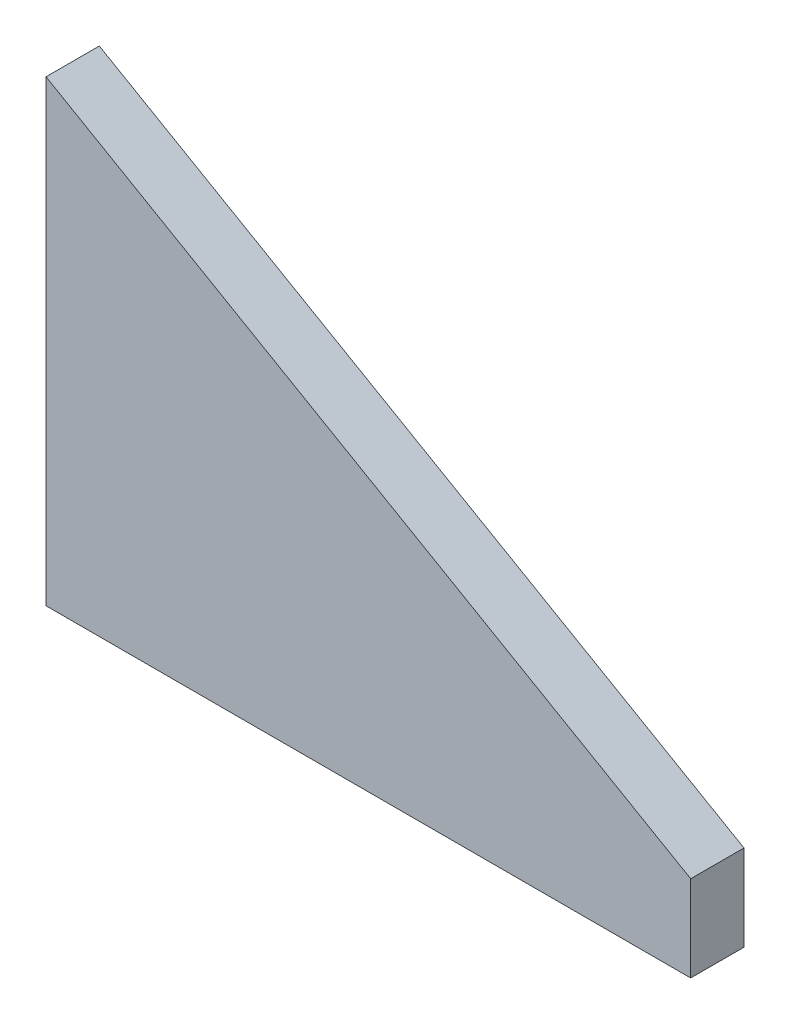
ISO-10303-21;
HEADER;
FILE_DESCRIPTION(('STEP AP214'),'2;1');
FILE_NAME('part.step','',(''),(''),'','','');
FILE_SCHEMA(('AUTOMOTIVE_DESIGN { 1 0 10303 214 1 1 1 1 }'));
ENDSEC;
DATA;
#1=APPLICATION_CONTEXT('core data for automotive mechanical design processes');
#2=APPLICATION_PROTOCOL_DEFINITION('international standard','automotive_design',2000,#1);
#3=PRODUCT_CONTEXT('',#1,'mechanical');
#4=PRODUCT('Part','Part','',(#3));
#5=PRODUCT_RELATED_PRODUCT_CATEGORY('part','',(#4));
#6=PRODUCT_DEFINITION_FORMATION('','',#4);
#7=PRODUCT_DEFINITION_CONTEXT('part definition',#1,'design');
#8=PRODUCT_DEFINITION('design','',#6,#7);
#9=PRODUCT_DEFINITION_SHAPE('','',#8);
#10=(LENGTH_UNIT() NAMED_UNIT(*) SI_UNIT(.MILLI.,.METRE.));
#11=(NAMED_UNIT(*) PLANE_ANGLE_UNIT() SI_UNIT($,.RADIAN.));
#12=(NAMED_UNIT(*) SI_UNIT($,.STERADIAN.) SOLID_ANGLE_UNIT());
#13=UNCERTAINTY_MEASURE_WITH_UNIT(LENGTH_MEASURE(1.E-05),#10,'distance_accuracy_value','');
#14=(GEOMETRIC_REPRESENTATION_CONTEXT(3) GLOBAL_UNCERTAINTY_ASSIGNED_CONTEXT((#13)) GLOBAL_UNIT_ASSIGNED_CONTEXT((#10,
#11,#12)) REPRESENTATION_CONTEXT('',''));
#15=CARTESIAN_POINT('',(0.,0.,0.));
#16=DIRECTION('',(0.,0.,1.));
#17=DIRECTION('',(1.,0.,0.));
#18=AXIS2_PLACEMENT_3D('',#15,#16,#17);
#19=CARTESIAN_POINT('',(-9.525,-9.525,0.787400000000001));
#20=DIRECTION('',(0.,1.,0.));
#21=DIRECTION('',(0.,0.,1.));
#22=AXIS2_PLACEMENT_3D('',#19,#20,#21);
#23=PLANE('',#22);
#24=DIRECTION('',(1.,0.,0.));
#25=VECTOR('',#24,1.);
#26=CARTESIAN_POINT('',(-9.525,-9.525,-0.787399999999994));
#27=LINE('',#26,#25);
#28=CARTESIAN_POINT('',(-9.525,-9.525,-0.787399999999994));
#29=VERTEX_POINT('',#28);
#30=CARTESIAN_POINT('',(9.525,-9.525,-0.787399999999994));
#31=VERTEX_POINT('',#30);
#32=EDGE_CURVE('E84',#29,#31,#27,.T.);
#33=ORIENTED_EDGE('',*,*,#32,.T.);
#34=DIRECTION('',(0.,0.,-1.));
#35=VECTOR('',#34,1.);
#36=CARTESIAN_POINT('',(9.525,-9.525,0.787400000000001));
#37=LINE('',#36,#35);
#38=CARTESIAN_POINT('',(9.525,-9.525,0.787400000000001));
#39=VERTEX_POINT('',#38);
#40=EDGE_CURVE('E38',#39,#31,#37,.T.);
#41=ORIENTED_EDGE('',*,*,#40,.F.);
#42=DIRECTION('',(1.,0.,0.));
#43=VECTOR('',#42,1.);
#44=CARTESIAN_POINT('',(-9.525,-9.525,0.787400000000001));
#45=LINE('',#44,#43);
#46=CARTESIAN_POINT('',(-9.525,-9.525,0.787400000000001));
#47=VERTEX_POINT('',#46);
#48=EDGE_CURVE('E77',#47,#39,#45,.T.);
#49=ORIENTED_EDGE('',*,*,#48,.F.);
#50=DIRECTION('',(0.,0.,-1.));
#51=VECTOR('',#50,1.);
#52=CARTESIAN_POINT('',(-9.525,-9.525,0.787400000000001));
#53=LINE('',#52,#51);
#54=EDGE_CURVE('E11',#47,#29,#53,.T.);
#55=ORIENTED_EDGE('',*,*,#54,.T.);
#56=EDGE_LOOP('',(#33,#41,#49,#55));
#57=FACE_BOUND('',#56,.T.);
#58=ADVANCED_FACE('F30',(#57),#23,.F.);
#59=CARTESIAN_POINT('',(9.525,-9.525,0.787400000000001));
#60=DIRECTION('',(-1.,0.,0.));
#61=DIRECTION('',(0.,0.,1.));
#62=AXIS2_PLACEMENT_3D('',#59,#60,#61);
#63=PLANE('',#62);
#64=DIRECTION('',(0.,1.,0.));
#65=VECTOR('',#64,1.);
#66=CARTESIAN_POINT('',(9.525,-9.525,-0.787399999999994));
#67=LINE('',#66,#65);
#68=CARTESIAN_POINT('',(9.525,-6.985,-0.787399999999994));
#69=VERTEX_POINT('',#68);
#70=EDGE_CURVE('E64',#31,#69,#67,.T.);
#71=ORIENTED_EDGE('',*,*,#70,.T.);
#72=DIRECTION('',(0.,0.,-1.));
#73=VECTOR('',#72,1.);
#74=CARTESIAN_POINT('',(9.525,-6.985,0.787400000000001));
#75=LINE('',#74,#73);
#76=CARTESIAN_POINT('',(9.525,-6.985,0.787400000000001));
#77=VERTEX_POINT('',#76);
#78=EDGE_CURVE('E85',#77,#69,#75,.T.);
#79=ORIENTED_EDGE('',*,*,#78,.F.);
#80=DIRECTION('',(0.,1.,0.));
#81=VECTOR('',#80,1.);
#82=CARTESIAN_POINT('',(9.525,-9.525,0.787400000000001));
#83=LINE('',#82,#81);
#84=EDGE_CURVE('E81',#39,#77,#83,.T.);
#85=ORIENTED_EDGE('',*,*,#84,.F.);
#86=ORIENTED_EDGE('',*,*,#40,.T.);
#87=EDGE_LOOP('',(#71,#79,#85,#86));
#88=FACE_BOUND('',#87,.T.);
#89=ADVANCED_FACE('F86',(#88),#63,.F.);
#90=CARTESIAN_POINT('',(-9.525,4.0132,0.787400000000001));
#91=DIRECTION('',(-0.499988999717658,-0.86603175470726,0.));
#92=DIRECTION('',(0.86603175470726,-0.499988999717658,0.));
#93=AXIS2_PLACEMENT_3D('',#90,#91,#92);
#94=PLANE('',#93);
#95=DIRECTION('',(-0.86603175470726,0.499988999717658,0.));
#96=VECTOR('',#95,1.);
#97=CARTESIAN_POINT('',(-9.525,4.0132,-0.787399999999994));
#98=LINE('',#97,#96);
#99=CARTESIAN_POINT('',(-9.525,4.0132,-0.787399999999994));
#100=VERTEX_POINT('',#99);
#101=EDGE_CURVE('E71',#69,#100,#98,.T.);
#102=ORIENTED_EDGE('',*,*,#101,.T.);
#103=DIRECTION('',(0.,0.,-1.));
#104=VECTOR('',#103,1.);
#105=CARTESIAN_POINT('',(-9.525,4.0132,0.787400000000001));
#106=LINE('',#105,#104);
#107=CARTESIAN_POINT('',(-9.525,4.0132,0.787400000000001));
#108=VERTEX_POINT('',#107);
#109=EDGE_CURVE('E90',#108,#100,#106,.T.);
#110=ORIENTED_EDGE('',*,*,#109,.F.);
#111=DIRECTION('',(-0.86603175470726,0.499988999717658,0.));
#112=VECTOR('',#111,1.);
#113=CARTESIAN_POINT('',(-9.525,4.0132,0.787400000000001));
#114=LINE('',#113,#112);
#115=EDGE_CURVE('E88',#77,#108,#114,.T.);
#116=ORIENTED_EDGE('',*,*,#115,.F.);
#117=ORIENTED_EDGE('',*,*,#78,.T.);
#118=EDGE_LOOP('',(#102,#110,#116,#117));
#119=FACE_BOUND('',#118,.T.);
#120=ADVANCED_FACE('F100',(#119),#94,.F.);
#121=CARTESIAN_POINT('',(-9.525,-6.985,0.787400000000001));
#122=DIRECTION('',(1.,0.,0.));
#123=DIRECTION('',(0.,0.,-1.));
#124=AXIS2_PLACEMENT_3D('',#121,#122,#123);
#125=PLANE('',#124);
#126=DIRECTION('',(0.,-1.,0.));
#127=VECTOR('',#126,1.);
#128=CARTESIAN_POINT('',(-9.525,-6.985,-0.787399999999994));
#129=LINE('',#128,#127);
#130=EDGE_CURVE('E97',#100,#29,#129,.T.);
#131=ORIENTED_EDGE('',*,*,#130,.T.);
#132=ORIENTED_EDGE('',*,*,#54,.F.);
#133=DIRECTION('',(0.,-1.,0.));
#134=VECTOR('',#133,1.);
#135=CARTESIAN_POINT('',(-9.525,-9.525,0.787400000000001));
#136=LINE('',#135,#134);
#137=EDGE_CURVE('E46',#108,#47,#136,.T.);
#138=ORIENTED_EDGE('',*,*,#137,.F.);
#139=ORIENTED_EDGE('',*,*,#109,.T.);
#140=EDGE_LOOP('',(#131,#132,#138,#139));
#141=FACE_BOUND('',#140,.T.);
#142=ADVANCED_FACE('F104',(#141),#125,.F.);
#143=CARTESIAN_POINT('',(-9.525,-9.525,0.787400000000001));
#144=DIRECTION('',(0.,0.,-1.));
#145=DIRECTION('',(-1.,0.,0.));
#146=AXIS2_PLACEMENT_3D('',#143,#144,#145);
#147=PLANE('',#146);
#148=ORIENTED_EDGE('',*,*,#137,.T.);
#149=ORIENTED_EDGE('',*,*,#48,.T.);
#150=ORIENTED_EDGE('',*,*,#84,.T.);
#151=ORIENTED_EDGE('',*,*,#115,.T.);
#152=EDGE_LOOP('',(#148,#149,#150,#151));
#153=FACE_BOUND('',#152,.T.);
#154=ADVANCED_FACE('F79',(#153),#147,.F.);
#155=CARTESIAN_POINT('',(-9.525,-9.525,-0.787399999999994));
#156=DIRECTION('',(0.,0.,-1.));
#157=DIRECTION('',(-1.,0.,0.));
#158=AXIS2_PLACEMENT_3D('',#155,#156,#157);
#159=PLANE('',#158);
#160=ORIENTED_EDGE('',*,*,#32,.F.);
#161=ORIENTED_EDGE('',*,*,#130,.F.);
#162=ORIENTED_EDGE('',*,*,#101,.F.);
#163=ORIENTED_EDGE('',*,*,#70,.F.);
#164=EDGE_LOOP('',(#160,#161,#162,#163));
#165=FACE_BOUND('',#164,.T.);
#166=ADVANCED_FACE('F103',(#165),#159,.T.);
#167=CLOSED_SHELL('',(#58,#89,#120,#142,#154,#166));
#168=MANIFOLD_SOLID_BREP('B2',#167);
#169=ADVANCED_BREP_SHAPE_REPRESENTATION('',(#18,#168),#14);
#170=SHAPE_DEFINITION_REPRESENTATION(#9,#169);
ENDSEC;
END-ISO-10303-21;
